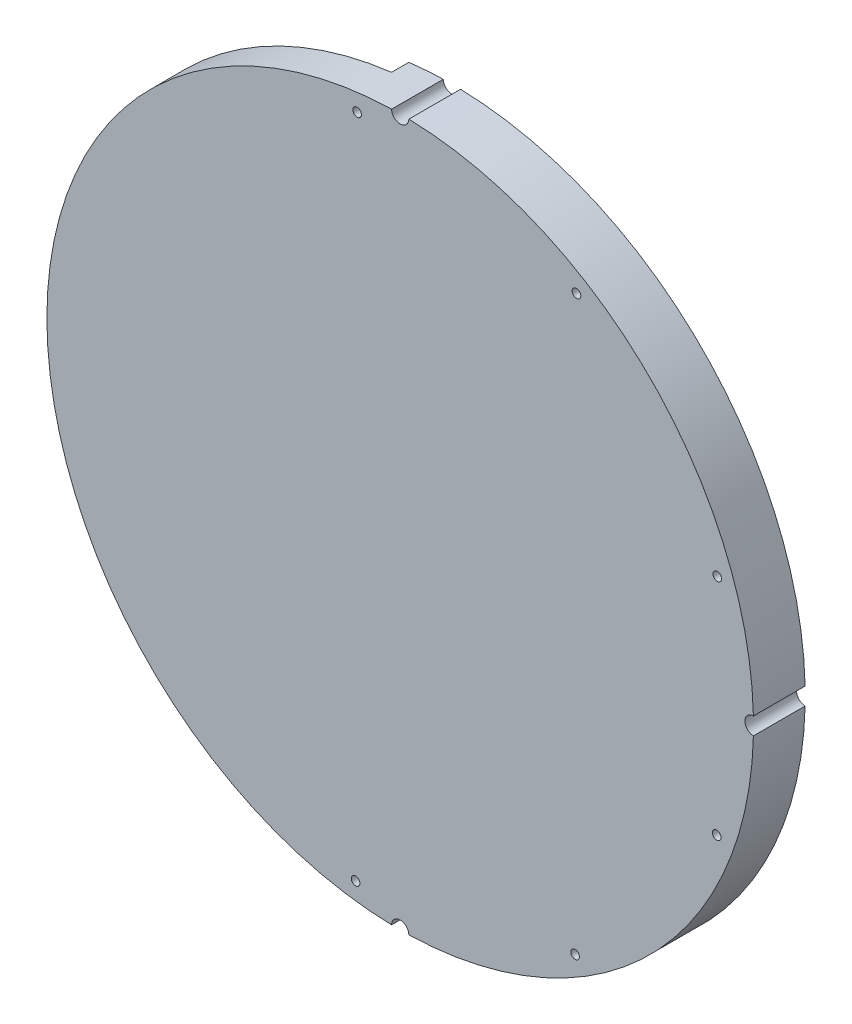
ISO-10303-21;
HEADER;
FILE_DESCRIPTION(('STEP AP214'),'2;1');
FILE_NAME('part.step','',(''),(''),'','','');
FILE_SCHEMA(('AUTOMOTIVE_DESIGN { 1 0 10303 214 1 1 1 1 }'));
ENDSEC;
DATA;
#1=APPLICATION_CONTEXT('core data for automotive mechanical design processes');
#2=APPLICATION_PROTOCOL_DEFINITION('international standard','automotive_design',2000,#1);
#3=PRODUCT_CONTEXT('',#1,'mechanical');
#4=PRODUCT('Part','Part','',(#3));
#5=PRODUCT_RELATED_PRODUCT_CATEGORY('part','',(#4));
#6=PRODUCT_DEFINITION_FORMATION('','',#4);
#7=PRODUCT_DEFINITION_CONTEXT('part definition',#1,'design');
#8=PRODUCT_DEFINITION('design','',#6,#7);
#9=PRODUCT_DEFINITION_SHAPE('','',#8);
#10=(LENGTH_UNIT() NAMED_UNIT(*) SI_UNIT(.MILLI.,.METRE.));
#11=(NAMED_UNIT(*) PLANE_ANGLE_UNIT() SI_UNIT($,.RADIAN.));
#12=(NAMED_UNIT(*) SI_UNIT($,.STERADIAN.) SOLID_ANGLE_UNIT());
#13=UNCERTAINTY_MEASURE_WITH_UNIT(LENGTH_MEASURE(1.E-05),#10,'distance_accuracy_value','');
#14=(GEOMETRIC_REPRESENTATION_CONTEXT(3) GLOBAL_UNCERTAINTY_ASSIGNED_CONTEXT((#13)) GLOBAL_UNIT_ASSIGNED_CONTEXT((#10,
#11,#12)) REPRESENTATION_CONTEXT('',''));
#15=CARTESIAN_POINT('',(0.,0.,0.));
#16=DIRECTION('',(0.,0.,1.));
#17=DIRECTION('',(1.,0.,0.));
#18=AXIS2_PLACEMENT_3D('',#15,#16,#17);
#19=CARTESIAN_POINT('',(0.,0.,8.));
#20=DIRECTION('',(0.,0.,-1.));
#21=DIRECTION('',(-1.,0.,0.));
#22=AXIS2_PLACEMENT_3D('',#19,#20,#21);
#23=CYLINDRICAL_SURFACE('',#22,82.);
#24=CARTESIAN_POINT('',(0.,0.,-4.));
#25=DIRECTION('',(0.,0.,-1.));
#26=DIRECTION('',(-1.,0.,0.));
#27=AXIS2_PLACEMENT_3D('',#24,#25,#26);
#28=CIRCLE('',#27,82.);
#29=CARTESIAN_POINT('',(81.9756097560976,-1.99985127347132,-4.));
#30=VERTEX_POINT('',#29);
#31=CARTESIAN_POINT('',(1.99985127347041,-81.9756097560976,-4.));
#32=VERTEX_POINT('',#31);
#33=EDGE_CURVE('E241',#30,#32,#28,.T.);
#34=ORIENTED_EDGE('',*,*,#33,.F.);
#35=DIRECTION('',(0.,0.,-1.));
#36=VECTOR('',#35,1.);
#37=CARTESIAN_POINT('',(81.9756097560976,-1.99985127347127,2.));
#38=LINE('',#37,#36);
#39=CARTESIAN_POINT('',(81.9756097560976,-1.99985127347127,8.));
#40=VERTEX_POINT('',#39);
#41=EDGE_CURVE('E62',#30,#40,#38,.F.);
#42=ORIENTED_EDGE('',*,*,#41,.T.);
#43=CARTESIAN_POINT('',(0.,0.,8.));
#44=DIRECTION('',(0.,0.,1.));
#45=DIRECTION('',(1.,0.,0.));
#46=AXIS2_PLACEMENT_3D('',#43,#44,#45);
#47=CIRCLE('',#46,82.);
#48=CARTESIAN_POINT('',(1.99985127347041,-81.9756097560976,8.));
#49=VERTEX_POINT('',#48);
#50=EDGE_CURVE('E140',#49,#40,#47,.T.);
#51=ORIENTED_EDGE('',*,*,#50,.F.);
#52=DIRECTION('',(0.,0.,-1.));
#53=VECTOR('',#52,1.);
#54=CARTESIAN_POINT('',(1.99985127347041,-81.9756097560976,2.));
#55=LINE('',#54,#53);
#56=EDGE_CURVE('E116',#49,#32,#55,.T.);
#57=ORIENTED_EDGE('',*,*,#56,.T.);
#58=EDGE_LOOP('',(#34,#42,#51,#57));
#59=FACE_BOUND('',#58,.T.);
#60=ADVANCED_FACE('F37',(#59),#23,.T.);
#61=CARTESIAN_POINT('',(-1.99985127347103,-81.9756097560976,-4.));
#62=VERTEX_POINT('',#61);
#63=CARTESIAN_POINT('',(-10.,-81.3879597975032,-4.));
#64=VERTEX_POINT('',#63);
#65=EDGE_CURVE('E131',#62,#64,#28,.T.);
#66=ORIENTED_EDGE('',*,*,#65,.F.);
#67=DIRECTION('',(0.,0.,-1.));
#68=VECTOR('',#67,1.);
#69=CARTESIAN_POINT('',(-1.99985127347099,-81.9756097560976,2.));
#70=LINE('',#69,#68);
#71=CARTESIAN_POINT('',(-1.99985127347099,-81.9756097560976,8.));
#72=VERTEX_POINT('',#71);
#73=EDGE_CURVE('E54',#62,#72,#70,.F.);
#74=ORIENTED_EDGE('',*,*,#73,.T.);
#75=CARTESIAN_POINT('',(-1.99985127347041,81.9756097560976,8.));
#76=VERTEX_POINT('',#75);
#77=EDGE_CURVE('E129',#76,#72,#47,.T.);
#78=ORIENTED_EDGE('',*,*,#77,.F.);
#79=DIRECTION('',(0.,0.,-1.));
#80=VECTOR('',#79,1.);
#81=CARTESIAN_POINT('',(-1.99985127347041,81.9756097560976,2.));
#82=LINE('',#81,#80);
#83=CARTESIAN_POINT('',(-1.99985127347041,81.9756097560976,-4.));
#84=VERTEX_POINT('',#83);
#85=EDGE_CURVE('E207',#76,#84,#82,.T.);
#86=ORIENTED_EDGE('',*,*,#85,.T.);
#87=CARTESIAN_POINT('',(-10.,81.3879597975032,-4.));
#88=VERTEX_POINT('',#87);
#89=EDGE_CURVE('E214',#88,#84,#28,.T.);
#90=ORIENTED_EDGE('',*,*,#89,.F.);
#91=DIRECTION('',(0.,0.,1.));
#92=VECTOR('',#91,1.);
#93=CARTESIAN_POINT('',(-10.,81.3879597975032,-4.));
#94=LINE('',#93,#92);
#95=CARTESIAN_POINT('',(-10.,81.3879597975032,0.));
#96=VERTEX_POINT('',#95);
#97=EDGE_CURVE('E155',#88,#96,#94,.T.);
#98=ORIENTED_EDGE('',*,*,#97,.T.);
#99=CARTESIAN_POINT('',(0.,0.,0.));
#100=DIRECTION('',(0.,0.,1.));
#101=DIRECTION('',(1.,0.,0.));
#102=AXIS2_PLACEMENT_3D('',#99,#100,#101);
#103=CIRCLE('',#102,82.);
#104=CARTESIAN_POINT('',(-10.,-81.3879597975032,0.));
#105=VERTEX_POINT('',#104);
#106=EDGE_CURVE('E148',#96,#105,#103,.T.);
#107=ORIENTED_EDGE('',*,*,#106,.T.);
#108=DIRECTION('',(0.,0.,1.));
#109=VECTOR('',#108,1.);
#110=CARTESIAN_POINT('',(-10.,-81.3879597975032,-4.));
#111=LINE('',#110,#109);
#112=EDGE_CURVE('E151',#64,#105,#111,.T.);
#113=ORIENTED_EDGE('',*,*,#112,.F.);
#114=EDGE_LOOP('',(#66,#74,#78,#86,#90,#98,#107,#113));
#115=FACE_BOUND('',#114,.T.);
#116=ADVANCED_FACE('F127',(#115),#23,.T.);
#117=CARTESIAN_POINT('',(0.,0.,0.));
#118=DIRECTION('',(0.,0.,1.));
#119=DIRECTION('',(1.,0.,0.));
#120=AXIS2_PLACEMENT_3D('',#117,#118,#119);
#121=PLANE('',#120);
#122=CARTESIAN_POINT('',(-10.3620302040633,-77.3086562426879,0.));
#123=DIRECTION('',(0.,0.,1.));
#124=DIRECTION('',(1.,0.,0.));
#125=AXIS2_PLACEMENT_3D('',#122,#123,#124);
#126=CIRCLE('',#125,1.);
#127=CARTESIAN_POINT('',(-9.36203020406326,-77.3086562426879,0.));
#128=VERTEX_POINT('',#127);
#129=EDGE_CURVE('E167',#128,#128,#126,.F.);
#130=ORIENTED_EDGE('',*,*,#129,.F.);
#131=EDGE_LOOP('',(#130));
#132=FACE_BOUND('',#131,.T.);
#133=CARTESIAN_POINT('',(-10.,77.3563184232549,0.));
#134=DIRECTION('',(0.,0.,1.));
#135=DIRECTION('',(1.,0.,0.));
#136=AXIS2_PLACEMENT_3D('',#133,#134,#135);
#137=CIRCLE('',#136,1.);
#138=CARTESIAN_POINT('',(-9.,77.3563184232549,0.));
#139=VERTEX_POINT('',#138);
#140=EDGE_CURVE('E166',#139,#139,#137,.F.);
#141=ORIENTED_EDGE('',*,*,#140,.F.);
#142=EDGE_LOOP('',(#141));
#143=FACE_BOUND('',#142,.T.);
#144=ORIENTED_EDGE('',*,*,#106,.F.);
#145=CARTESIAN_POINT('',(-0.882513356391515,85.495445318308,0.));
#146=DIRECTION('',(0.,0.,1.));
#147=DIRECTION('',(1.,0.,0.));
#148=AXIS2_PLACEMENT_3D('',#145,#146,#147);
#149=CIRCLE('',#148,10.);
#150=CARTESIAN_POINT('',(-0.779295419971455,75.495978029617,0.));
#151=VERTEX_POINT('',#150);
#152=EDGE_CURVE('E46',#96,#151,#149,.T.);
#153=ORIENTED_EDGE('',*,*,#152,.T.);
#154=CARTESIAN_POINT('',(0.,0.,0.));
#155=DIRECTION('',(0.,0.,1.));
#156=DIRECTION('',(-1.,0.,0.));
#157=AXIS2_PLACEMENT_3D('',#154,#155,#156);
#158=CIRCLE('',#157,75.5);
#159=CARTESIAN_POINT('',(-0.77929541997137,-75.495978029617,0.));
#160=VERTEX_POINT('',#159);
#161=EDGE_CURVE('E213',#160,#151,#158,.T.);
#162=ORIENTED_EDGE('',*,*,#161,.F.);
#163=CARTESIAN_POINT('',(-0.88251335639142,-85.495445318308,0.));
#164=DIRECTION('',(0.,0.,1.));
#165=DIRECTION('',(1.,0.,0.));
#166=AXIS2_PLACEMENT_3D('',#163,#164,#165);
#167=CIRCLE('',#166,10.);
#168=EDGE_CURVE('E11',#160,#105,#167,.T.);
#169=ORIENTED_EDGE('',*,*,#168,.T.);
#170=EDGE_LOOP('',(#144,#153,#162,#169));
#171=FACE_BOUND('',#170,.T.);
#172=ADVANCED_FACE('F231',(#132,#143,#171),#121,.F.);
#173=CARTESIAN_POINT('',(81.9756097560976,1.99985127347013,8.));
#174=VERTEX_POINT('',#173);
#175=CARTESIAN_POINT('',(1.99985127347099,81.9756097560976,8.));
#176=VERTEX_POINT('',#175);
#177=EDGE_CURVE('E142',#174,#176,#47,.T.);
#178=ORIENTED_EDGE('',*,*,#177,.F.);
#179=DIRECTION('',(0.,0.,-1.));
#180=VECTOR('',#179,1.);
#181=CARTESIAN_POINT('',(81.9756097560976,1.99985127347013,2.));
#182=LINE('',#181,#180);
#183=CARTESIAN_POINT('',(81.9756097560976,1.99985127347013,-4.));
#184=VERTEX_POINT('',#183);
#185=EDGE_CURVE('E132',#174,#184,#182,.T.);
#186=ORIENTED_EDGE('',*,*,#185,.T.);
#187=CARTESIAN_POINT('',(1.99985127347103,81.9756097560976,-4.));
#188=VERTEX_POINT('',#187);
#189=EDGE_CURVE('E218',#188,#184,#28,.T.);
#190=ORIENTED_EDGE('',*,*,#189,.F.);
#191=DIRECTION('',(0.,0.,-1.));
#192=VECTOR('',#191,1.);
#193=CARTESIAN_POINT('',(1.99985127347099,81.9756097560976,2.));
#194=LINE('',#193,#192);
#195=EDGE_CURVE('E210',#188,#176,#194,.F.);
#196=ORIENTED_EDGE('',*,*,#195,.T.);
#197=EDGE_LOOP('',(#178,#186,#190,#196));
#198=FACE_BOUND('',#197,.T.);
#199=ADVANCED_FACE('F247',(#198),#23,.T.);
#200=CARTESIAN_POINT('',(0.,0.,8.));
#201=DIRECTION('',(0.,0.,1.));
#202=DIRECTION('',(1.,0.,0.));
#203=AXIS2_PLACEMENT_3D('',#200,#201,#202);
#204=PLANE('',#203);
#205=CARTESIAN_POINT('',(40.9104489457289,66.4103543663103,8.));
#206=DIRECTION('',(0.,0.,1.));
#207=DIRECTION('',(1.,0.,0.));
#208=AXIS2_PLACEMENT_3D('',#205,#206,#207);
#209=CIRCLE('',#208,1.);
#210=CARTESIAN_POINT('',(41.9104489457289,66.4103543663103,8.));
#211=VERTEX_POINT('',#210);
#212=EDGE_CURVE('E181',#211,#211,#209,.F.);
#213=ORIENTED_EDGE('',*,*,#212,.T.);
#214=EDGE_LOOP('',(#213));
#215=FACE_BOUND('',#214,.T.);
#216=CARTESIAN_POINT('',(73.5867803591295,25.8647589661537,8.));
#217=DIRECTION('',(0.,0.,1.));
#218=DIRECTION('',(1.,0.,0.));
#219=AXIS2_PLACEMENT_3D('',#216,#217,#218);
#220=CIRCLE('',#219,1.);
#221=CARTESIAN_POINT('',(74.5867803591295,25.8647589661537,8.));
#222=VERTEX_POINT('',#221);
#223=EDGE_CURVE('E178',#222,#222,#220,.F.);
#224=ORIENTED_EDGE('',*,*,#223,.T.);
#225=EDGE_LOOP('',(#224));
#226=FACE_BOUND('',#225,.T.);
#227=CARTESIAN_POINT('',(73.4648893997083,-26.2089684171016,8.));
#228=DIRECTION('',(0.,0.,1.));
#229=DIRECTION('',(1.,0.,0.));
#230=AXIS2_PLACEMENT_3D('',#227,#228,#229);
#231=CIRCLE('',#230,1.);
#232=CARTESIAN_POINT('',(74.4648893997083,-26.2089684171016,8.));
#233=VERTEX_POINT('',#232);
#234=EDGE_CURVE('E175',#233,#233,#231,.F.);
#235=ORIENTED_EDGE('',*,*,#234,.T.);
#236=EDGE_LOOP('',(#235));
#237=FACE_BOUND('',#236,.T.);
#238=CARTESIAN_POINT('',(40.599103852603,-66.6011468847614,8.));
#239=DIRECTION('',(0.,0.,1.));
#240=DIRECTION('',(1.,0.,0.));
#241=AXIS2_PLACEMENT_3D('',#238,#239,#240);
#242=CIRCLE('',#241,1.);
#243=CARTESIAN_POINT('',(41.599103852603,-66.6011468847614,8.));
#244=VERTEX_POINT('',#243);
#245=EDGE_CURVE('E171',#244,#244,#242,.F.);
#246=ORIENTED_EDGE('',*,*,#245,.T.);
#247=EDGE_LOOP('',(#246));
#248=FACE_BOUND('',#247,.T.);
#249=CARTESIAN_POINT('',(-10.3620302040633,-77.3086562426879,8.));
#250=DIRECTION('',(0.,0.,1.));
#251=DIRECTION('',(1.,0.,0.));
#252=AXIS2_PLACEMENT_3D('',#249,#250,#251);
#253=CIRCLE('',#252,1.);
#254=CARTESIAN_POINT('',(-9.36203020406326,-77.3086562426879,8.));
#255=VERTEX_POINT('',#254);
#256=EDGE_CURVE('E41',#255,#255,#253,.F.);
#257=ORIENTED_EDGE('',*,*,#256,.T.);
#258=EDGE_LOOP('',(#257));
#259=FACE_BOUND('',#258,.T.);
#260=CARTESIAN_POINT('',(-10.,77.3563184232549,8.));
#261=DIRECTION('',(0.,0.,1.));
#262=DIRECTION('',(1.,0.,0.));
#263=AXIS2_PLACEMENT_3D('',#260,#261,#262);
#264=CIRCLE('',#263,1.);
#265=CARTESIAN_POINT('',(-9.,77.3563184232549,8.));
#266=VERTEX_POINT('',#265);
#267=EDGE_CURVE('E163',#266,#266,#264,.F.);
#268=ORIENTED_EDGE('',*,*,#267,.T.);
#269=EDGE_LOOP('',(#268));
#270=FACE_BOUND('',#269,.T.);
#271=CARTESIAN_POINT('',(82.,-5.72602939570274E-13,8.));
#272=DIRECTION('',(0.,0.,-1.));
#273=DIRECTION('',(0.,1.,0.));
#274=AXIS2_PLACEMENT_3D('',#271,#272,#273);
#275=CIRCLE('',#274,2.);
#276=EDGE_CURVE('E197',#40,#174,#275,.T.);
#277=ORIENTED_EDGE('',*,*,#276,.T.);
#278=ORIENTED_EDGE('',*,*,#177,.T.);
#279=CARTESIAN_POINT('',(2.86301469785137E-13,82.,8.));
#280=DIRECTION('',(0.,0.,-1.));
#281=DIRECTION('',(-1.,0.,0.));
#282=AXIS2_PLACEMENT_3D('',#279,#280,#281);
#283=CIRCLE('',#282,2.);
#284=EDGE_CURVE('E138',#176,#76,#283,.T.);
#285=ORIENTED_EDGE('',*,*,#284,.T.);
#286=ORIENTED_EDGE('',*,*,#77,.T.);
#287=CARTESIAN_POINT('',(-2.86301469785137E-13,-82.,8.));
#288=DIRECTION('',(0.,0.,-1.));
#289=DIRECTION('',(1.,0.,0.));
#290=AXIS2_PLACEMENT_3D('',#287,#288,#289);
#291=CIRCLE('',#290,2.);
#292=EDGE_CURVE('E113',#72,#49,#291,.T.);
#293=ORIENTED_EDGE('',*,*,#292,.T.);
#294=ORIENTED_EDGE('',*,*,#50,.T.);
#295=EDGE_LOOP('',(#277,#278,#285,#286,#293,#294));
#296=FACE_BOUND('',#295,.T.);
#297=ADVANCED_FACE('F136',(#215,#226,#237,#248,#259,#270,#296),#204,.T.);
#298=CARTESIAN_POINT('',(0.,0.,-4.));
#299=DIRECTION('',(0.,0.,1.));
#300=DIRECTION('',(1.,0.,0.));
#301=AXIS2_PLACEMENT_3D('',#298,#299,#300);
#302=CYLINDRICAL_SURFACE('',#301,75.5);
#303=ORIENTED_EDGE('',*,*,#161,.T.);
#304=DIRECTION('',(0.,0.,1.));
#305=VECTOR('',#304,1.);
#306=CARTESIAN_POINT('',(-0.779295419971455,75.495978029617,-4.));
#307=LINE('',#306,#305);
#308=CARTESIAN_POINT('',(-0.779295419971455,75.495978029617,-4.));
#309=VERTEX_POINT('',#308);
#310=EDGE_CURVE('E144',#151,#309,#307,.F.);
#311=ORIENTED_EDGE('',*,*,#310,.T.);
#312=CARTESIAN_POINT('',(0.,0.,-4.));
#313=DIRECTION('',(0.,0.,1.));
#314=DIRECTION('',(-1.,0.,0.));
#315=AXIS2_PLACEMENT_3D('',#312,#313,#314);
#316=CIRCLE('',#315,75.5);
#317=CARTESIAN_POINT('',(-0.77929541997137,-75.495978029617,-4.));
#318=VERTEX_POINT('',#317);
#319=EDGE_CURVE('E217',#318,#309,#316,.T.);
#320=ORIENTED_EDGE('',*,*,#319,.F.);
#321=DIRECTION('',(0.,0.,1.));
#322=VECTOR('',#321,1.);
#323=CARTESIAN_POINT('',(-0.77929541997137,-75.495978029617,-4.));
#324=LINE('',#323,#322);
#325=EDGE_CURVE('E139',#318,#160,#324,.T.);
#326=ORIENTED_EDGE('',*,*,#325,.T.);
#327=EDGE_LOOP('',(#303,#311,#320,#326));
#328=FACE_BOUND('',#327,.T.);
#329=ADVANCED_FACE('F237',(#328),#302,.F.);
#330=CARTESIAN_POINT('',(0.,0.,-4.));
#331=DIRECTION('',(0.,0.,-1.));
#332=DIRECTION('',(-1.,0.,0.));
#333=AXIS2_PLACEMENT_3D('',#330,#331,#332);
#334=PLANE('',#333);
#335=CARTESIAN_POINT('',(40.9104489457289,66.4103543663103,-4.));
#336=DIRECTION('',(0.,0.,-1.));
#337=DIRECTION('',(-1.,0.,0.));
#338=AXIS2_PLACEMENT_3D('',#335,#336,#337);
#339=CIRCLE('',#338,1.);
#340=CARTESIAN_POINT('',(39.9104489457289,66.4103543663103,-4.));
#341=VERTEX_POINT('',#340);
#342=EDGE_CURVE('E179',#341,#341,#339,.F.);
#343=ORIENTED_EDGE('',*,*,#342,.T.);
#344=EDGE_LOOP('',(#343));
#345=FACE_BOUND('',#344,.T.);
#346=CARTESIAN_POINT('',(73.5867803591295,25.8647589661537,-4.));
#347=DIRECTION('',(0.,0.,-1.));
#348=DIRECTION('',(-1.,0.,0.));
#349=AXIS2_PLACEMENT_3D('',#346,#347,#348);
#350=CIRCLE('',#349,1.);
#351=CARTESIAN_POINT('',(72.5867803591295,25.8647589661537,-4.));
#352=VERTEX_POINT('',#351);
#353=EDGE_CURVE('E176',#352,#352,#350,.F.);
#354=ORIENTED_EDGE('',*,*,#353,.T.);
#355=EDGE_LOOP('',(#354));
#356=FACE_BOUND('',#355,.T.);
#357=CARTESIAN_POINT('',(73.4648893997083,-26.2089684171016,-4.));
#358=DIRECTION('',(0.,0.,-1.));
#359=DIRECTION('',(-1.,0.,0.));
#360=AXIS2_PLACEMENT_3D('',#357,#358,#359);
#361=CIRCLE('',#360,1.);
#362=CARTESIAN_POINT('',(72.4648893997083,-26.2089684171016,-4.));
#363=VERTEX_POINT('',#362);
#364=EDGE_CURVE('E172',#363,#363,#361,.F.);
#365=ORIENTED_EDGE('',*,*,#364,.T.);
#366=EDGE_LOOP('',(#365));
#367=FACE_BOUND('',#366,.T.);
#368=CARTESIAN_POINT('',(40.599103852603,-66.6011468847614,-4.));
#369=DIRECTION('',(0.,0.,-1.));
#370=DIRECTION('',(-1.,0.,0.));
#371=AXIS2_PLACEMENT_3D('',#368,#369,#370);
#372=CIRCLE('',#371,1.);
#373=CARTESIAN_POINT('',(39.599103852603,-66.6011468847614,-4.));
#374=VERTEX_POINT('',#373);
#375=EDGE_CURVE('E168',#374,#374,#372,.F.);
#376=ORIENTED_EDGE('',*,*,#375,.T.);
#377=EDGE_LOOP('',(#376));
#378=FACE_BOUND('',#377,.T.);
#379=CARTESIAN_POINT('',(82.,-5.72602939570274E-13,-4.));
#380=DIRECTION('',(0.,0.,-1.));
#381=DIRECTION('',(0.,1.,0.));
#382=AXIS2_PLACEMENT_3D('',#379,#380,#381);
#383=CIRCLE('',#382,2.);
#384=EDGE_CURVE('E121',#30,#184,#383,.T.);
#385=ORIENTED_EDGE('',*,*,#384,.F.);
#386=ORIENTED_EDGE('',*,*,#33,.T.);
#387=CARTESIAN_POINT('',(-2.86301469785137E-13,-82.,-4.));
#388=DIRECTION('',(0.,0.,-1.));
#389=DIRECTION('',(1.,0.,0.));
#390=AXIS2_PLACEMENT_3D('',#387,#388,#389);
#391=CIRCLE('',#390,2.);
#392=EDGE_CURVE('E122',#62,#32,#391,.T.);
#393=ORIENTED_EDGE('',*,*,#392,.F.);
#394=ORIENTED_EDGE('',*,*,#65,.T.);
#395=CARTESIAN_POINT('',(-0.88251335639142,-85.495445318308,-4.));
#396=DIRECTION('',(0.,0.,-1.));
#397=DIRECTION('',(-1.,0.,0.));
#398=AXIS2_PLACEMENT_3D('',#395,#396,#397);
#399=CIRCLE('',#398,10.);
#400=EDGE_CURVE('E158',#64,#318,#399,.T.);
#401=ORIENTED_EDGE('',*,*,#400,.T.);
#402=ORIENTED_EDGE('',*,*,#319,.T.);
#403=CARTESIAN_POINT('',(-0.882513356391515,85.495445318308,-4.));
#404=DIRECTION('',(0.,0.,-1.));
#405=DIRECTION('',(-1.,0.,0.));
#406=AXIS2_PLACEMENT_3D('',#403,#404,#405);
#407=CIRCLE('',#406,10.);
#408=EDGE_CURVE('E160',#309,#88,#407,.T.);
#409=ORIENTED_EDGE('',*,*,#408,.T.);
#410=ORIENTED_EDGE('',*,*,#89,.T.);
#411=CARTESIAN_POINT('',(2.86301469785137E-13,82.,-4.));
#412=DIRECTION('',(0.,0.,-1.));
#413=DIRECTION('',(-1.,0.,0.));
#414=AXIS2_PLACEMENT_3D('',#411,#412,#413);
#415=CIRCLE('',#414,2.);
#416=EDGE_CURVE('E205',#188,#84,#415,.T.);
#417=ORIENTED_EDGE('',*,*,#416,.F.);
#418=ORIENTED_EDGE('',*,*,#189,.T.);
#419=EDGE_LOOP('',(#385,#386,#393,#394,#401,#402,#409,#410,#417,#418));
#420=FACE_BOUND('',#419,.T.);
#421=ADVANCED_FACE('F239',(#345,#356,#367,#378,#420),#334,.T.);
#422=CARTESIAN_POINT('',(-0.882513356391515,85.495445318308,-4.));
#423=DIRECTION('',(0.,0.,1.));
#424=DIRECTION('',(1.,0.,0.));
#425=AXIS2_PLACEMENT_3D('',#422,#423,#424);
#426=CYLINDRICAL_SURFACE('',#425,10.);
#427=ORIENTED_EDGE('',*,*,#408,.F.);
#428=ORIENTED_EDGE('',*,*,#310,.F.);
#429=ORIENTED_EDGE('',*,*,#152,.F.);
#430=ORIENTED_EDGE('',*,*,#97,.F.);
#431=EDGE_LOOP('',(#427,#428,#429,#430));
#432=FACE_BOUND('',#431,.T.);
#433=ADVANCED_FACE('F227',(#432),#426,.T.);
#434=CARTESIAN_POINT('',(-0.88251335639142,-85.495445318308,8.));
#435=DIRECTION('',(0.,0.,1.));
#436=DIRECTION('',(1.,0.,0.));
#437=AXIS2_PLACEMENT_3D('',#434,#435,#436);
#438=CYLINDRICAL_SURFACE('',#437,10.);
#439=ORIENTED_EDGE('',*,*,#400,.F.);
#440=ORIENTED_EDGE('',*,*,#112,.T.);
#441=ORIENTED_EDGE('',*,*,#168,.F.);
#442=ORIENTED_EDGE('',*,*,#325,.F.);
#443=EDGE_LOOP('',(#439,#440,#441,#442));
#444=FACE_BOUND('',#443,.T.);
#445=ADVANCED_FACE('F39',(#444),#438,.T.);
#446=CARTESIAN_POINT('',(2.86301469785137E-13,82.,8.));
#447=DIRECTION('',(0.,0.,-1.));
#448=DIRECTION('',(-1.,0.,0.));
#449=AXIS2_PLACEMENT_3D('',#446,#447,#448);
#450=CYLINDRICAL_SURFACE('',#449,2.);
#451=ORIENTED_EDGE('',*,*,#416,.T.);
#452=ORIENTED_EDGE('',*,*,#85,.F.);
#453=ORIENTED_EDGE('',*,*,#284,.F.);
#454=ORIENTED_EDGE('',*,*,#195,.F.);
#455=EDGE_LOOP('',(#451,#452,#453,#454));
#456=FACE_BOUND('',#455,.T.);
#457=ADVANCED_FACE('F273',(#456),#450,.F.);
#458=CARTESIAN_POINT('',(-2.86301469785137E-13,-82.,8.));
#459=DIRECTION('',(0.,0.,-1.));
#460=DIRECTION('',(-1.,0.,0.));
#461=AXIS2_PLACEMENT_3D('',#458,#459,#460);
#462=CYLINDRICAL_SURFACE('',#461,2.);
#463=ORIENTED_EDGE('',*,*,#392,.T.);
#464=ORIENTED_EDGE('',*,*,#56,.F.);
#465=ORIENTED_EDGE('',*,*,#292,.F.);
#466=ORIENTED_EDGE('',*,*,#73,.F.);
#467=EDGE_LOOP('',(#463,#464,#465,#466));
#468=FACE_BOUND('',#467,.T.);
#469=ADVANCED_FACE('F114',(#468),#462,.F.);
#470=CARTESIAN_POINT('',(82.,-5.72602939570274E-13,8.));
#471=DIRECTION('',(0.,0.,-1.));
#472=DIRECTION('',(-1.,0.,0.));
#473=AXIS2_PLACEMENT_3D('',#470,#471,#472);
#474=CYLINDRICAL_SURFACE('',#473,2.);
#475=ORIENTED_EDGE('',*,*,#384,.T.);
#476=ORIENTED_EDGE('',*,*,#185,.F.);
#477=ORIENTED_EDGE('',*,*,#276,.F.);
#478=ORIENTED_EDGE('',*,*,#41,.F.);
#479=EDGE_LOOP('',(#475,#476,#477,#478));
#480=FACE_BOUND('',#479,.T.);
#481=ADVANCED_FACE('F248',(#480),#474,.F.);
#482=CARTESIAN_POINT('',(-10.,77.3563184232549,-26.));
#483=DIRECTION('',(0.,0.,1.));
#484=DIRECTION('',(1.,0.,0.));
#485=AXIS2_PLACEMENT_3D('',#482,#483,#484);
#486=CYLINDRICAL_SURFACE('',#485,1.);
#487=ORIENTED_EDGE('',*,*,#267,.F.);
#488=EDGE_LOOP('',(#487));
#489=FACE_BOUND('',#488,.T.);
#490=ORIENTED_EDGE('',*,*,#140,.T.);
#491=EDGE_LOOP('',(#490));
#492=FACE_BOUND('',#491,.T.);
#493=ADVANCED_FACE('F281',(#489,#492),#486,.F.);
#494=CARTESIAN_POINT('',(40.599103852603,-66.6011468847614,-26.));
#495=DIRECTION('',(0.,0.,1.));
#496=DIRECTION('',(1.,0.,0.));
#497=AXIS2_PLACEMENT_3D('',#494,#495,#496);
#498=CYLINDRICAL_SURFACE('',#497,1.);
#499=ORIENTED_EDGE('',*,*,#245,.F.);
#500=EDGE_LOOP('',(#499));
#501=FACE_BOUND('',#500,.T.);
#502=ORIENTED_EDGE('',*,*,#375,.F.);
#503=EDGE_LOOP('',(#502));
#504=FACE_BOUND('',#503,.T.);
#505=ADVANCED_FACE('F284',(#501,#504),#498,.F.);
#506=CARTESIAN_POINT('',(73.4648893997083,-26.2089684171016,-26.));
#507=DIRECTION('',(0.,0.,1.));
#508=DIRECTION('',(1.,0.,0.));
#509=AXIS2_PLACEMENT_3D('',#506,#507,#508);
#510=CYLINDRICAL_SURFACE('',#509,1.);
#511=ORIENTED_EDGE('',*,*,#234,.F.);
#512=EDGE_LOOP('',(#511));
#513=FACE_BOUND('',#512,.T.);
#514=ORIENTED_EDGE('',*,*,#364,.F.);
#515=EDGE_LOOP('',(#514));
#516=FACE_BOUND('',#515,.T.);
#517=ADVANCED_FACE('F293',(#513,#516),#510,.F.);
#518=CARTESIAN_POINT('',(73.5867803591295,25.8647589661537,-26.));
#519=DIRECTION('',(0.,0.,1.));
#520=DIRECTION('',(1.,0.,0.));
#521=AXIS2_PLACEMENT_3D('',#518,#519,#520);
#522=CYLINDRICAL_SURFACE('',#521,1.);
#523=ORIENTED_EDGE('',*,*,#223,.F.);
#524=EDGE_LOOP('',(#523));
#525=FACE_BOUND('',#524,.T.);
#526=ORIENTED_EDGE('',*,*,#353,.F.);
#527=EDGE_LOOP('',(#526));
#528=FACE_BOUND('',#527,.T.);
#529=ADVANCED_FACE('F297',(#525,#528),#522,.F.);
#530=CARTESIAN_POINT('',(40.9104489457289,66.4103543663103,-26.));
#531=DIRECTION('',(0.,0.,1.));
#532=DIRECTION('',(1.,0.,0.));
#533=AXIS2_PLACEMENT_3D('',#530,#531,#532);
#534=CYLINDRICAL_SURFACE('',#533,1.);
#535=ORIENTED_EDGE('',*,*,#212,.F.);
#536=EDGE_LOOP('',(#535));
#537=FACE_BOUND('',#536,.T.);
#538=ORIENTED_EDGE('',*,*,#342,.F.);
#539=EDGE_LOOP('',(#538));
#540=FACE_BOUND('',#539,.T.);
#541=ADVANCED_FACE('F289',(#537,#540),#534,.F.);
#542=CARTESIAN_POINT('',(-10.3620302040633,-77.3086562426879,-26.));
#543=DIRECTION('',(0.,0.,1.));
#544=DIRECTION('',(1.,0.,0.));
#545=AXIS2_PLACEMENT_3D('',#542,#543,#544);
#546=CYLINDRICAL_SURFACE('',#545,1.);
#547=ORIENTED_EDGE('',*,*,#256,.F.);
#548=EDGE_LOOP('',(#547));
#549=FACE_BOUND('',#548,.T.);
#550=ORIENTED_EDGE('',*,*,#129,.T.);
#551=EDGE_LOOP('',(#550));
#552=FACE_BOUND('',#551,.T.);
#553=ADVANCED_FACE('F286',(#549,#552),#546,.F.);
#554=CLOSED_SHELL('',(#60,#116,#172,#199,#297,#329,#421,#433,#445,#457,#469,#481,#493,#505,#517,
#529,#541,#553));
#555=MANIFOLD_SOLID_BREP('B2',#554);
#556=ADVANCED_BREP_SHAPE_REPRESENTATION('',(#18,#555),#14);
#557=SHAPE_DEFINITION_REPRESENTATION(#9,#556);
ENDSEC;
END-ISO-10303-21;
